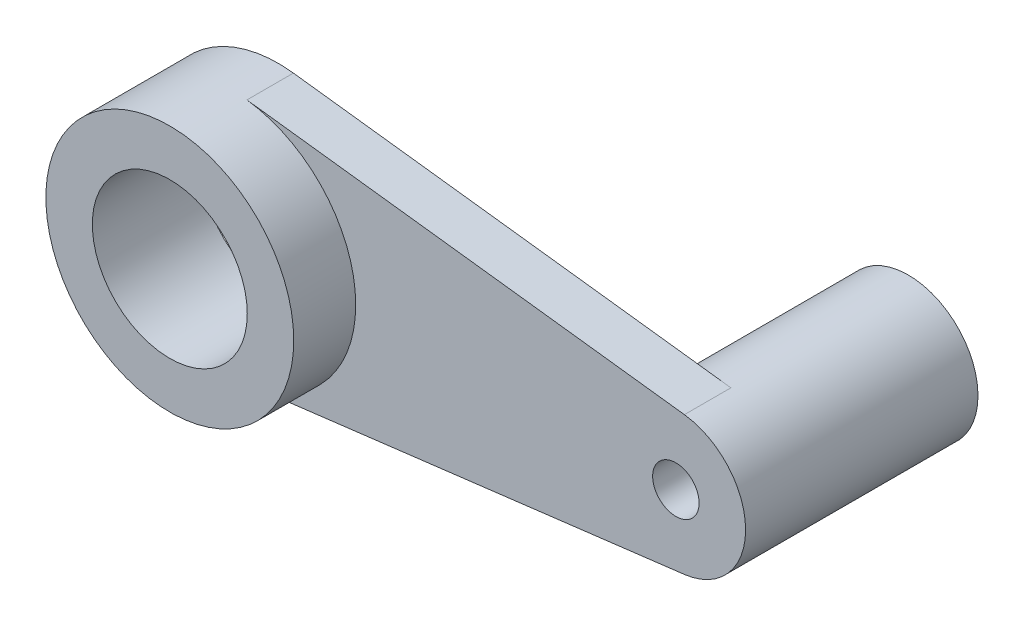
ISO-10303-21;
HEADER;
FILE_DESCRIPTION(('STEP AP214'),'2;1');
FILE_NAME('part.step','',(''),(''),'','','');
FILE_SCHEMA(('AUTOMOTIVE_DESIGN { 1 0 10303 214 1 1 1 1 }'));
ENDSEC;
DATA;
#1=APPLICATION_CONTEXT('core data for automotive mechanical design processes');
#2=APPLICATION_PROTOCOL_DEFINITION('international standard','automotive_design',2000,#1);
#3=PRODUCT_CONTEXT('',#1,'mechanical');
#4=PRODUCT('Part','Part','',(#3));
#5=PRODUCT_RELATED_PRODUCT_CATEGORY('part','',(#4));
#6=PRODUCT_DEFINITION_FORMATION('','',#4);
#7=PRODUCT_DEFINITION_CONTEXT('part definition',#1,'design');
#8=PRODUCT_DEFINITION('design','',#6,#7);
#9=PRODUCT_DEFINITION_SHAPE('','',#8);
#10=(LENGTH_UNIT() NAMED_UNIT(*) SI_UNIT(.MILLI.,.METRE.));
#11=(NAMED_UNIT(*) PLANE_ANGLE_UNIT() SI_UNIT($,.RADIAN.));
#12=(NAMED_UNIT(*) SI_UNIT($,.STERADIAN.) SOLID_ANGLE_UNIT());
#13=UNCERTAINTY_MEASURE_WITH_UNIT(LENGTH_MEASURE(1.E-05),#10,'distance_accuracy_value','');
#14=(GEOMETRIC_REPRESENTATION_CONTEXT(3) GLOBAL_UNCERTAINTY_ASSIGNED_CONTEXT((#13)) GLOBAL_UNIT_ASSIGNED_CONTEXT((#10,
#11,#12)) REPRESENTATION_CONTEXT('',''));
#15=CARTESIAN_POINT('',(0.,0.,0.));
#16=DIRECTION('',(0.,0.,1.));
#17=DIRECTION('',(1.,0.,0.));
#18=AXIS2_PLACEMENT_3D('',#15,#16,#17);
#19=CARTESIAN_POINT('',(0.,0.,14.));
#20=DIRECTION('',(0.,0.,-1.));
#21=DIRECTION('',(-1.,0.,0.));
#22=AXIS2_PLACEMENT_3D('',#19,#20,#21);
#23=CYLINDRICAL_SURFACE('',#22,16.);
#24=CARTESIAN_POINT('',(0.,0.,14.));
#25=DIRECTION('',(0.,0.,1.));
#26=DIRECTION('',(1.,0.,0.));
#27=AXIS2_PLACEMENT_3D('',#24,#25,#26);
#28=CIRCLE('',#27,16.);
#29=CARTESIAN_POINT('',(16.,0.,14.));
#30=VERTEX_POINT('',#29);
#31=EDGE_CURVE('E11',#30,#30,#28,.T.);
#32=ORIENTED_EDGE('',*,*,#31,.F.);
#33=EDGE_LOOP('',(#32));
#34=FACE_BOUND('',#33,.T.);
#35=DIRECTION('',(0.,0.,-1.));
#36=VECTOR('',#35,1.);
#37=CARTESIAN_POINT('',(1.95354893349608,-15.88029113601,6.));
#38=LINE('',#37,#36);
#39=CARTESIAN_POINT('',(1.95354893349608,-15.88029113601,6.));
#40=VERTEX_POINT('',#39);
#41=CARTESIAN_POINT('',(1.95354893349608,-15.88029113601,0.));
#42=VERTEX_POINT('',#41);
#43=EDGE_CURVE('E76',#40,#42,#38,.T.);
#44=ORIENTED_EDGE('',*,*,#43,.F.);
#45=CARTESIAN_POINT('',(0.,0.,6.));
#46=DIRECTION('',(0.,0.,1.));
#47=DIRECTION('',(1.,0.,0.));
#48=AXIS2_PLACEMENT_3D('',#45,#46,#47);
#49=CIRCLE('',#48,16.);
#50=CARTESIAN_POINT('',(1.95354893349608,15.88029113601,6.));
#51=VERTEX_POINT('',#50);
#52=EDGE_CURVE('E67',#40,#51,#49,.T.);
#53=ORIENTED_EDGE('',*,*,#52,.T.);
#54=DIRECTION('',(0.,0.,-1.));
#55=VECTOR('',#54,1.);
#56=CARTESIAN_POINT('',(1.95354893349608,15.88029113601,6.));
#57=LINE('',#56,#55);
#58=CARTESIAN_POINT('',(1.95354893349608,15.88029113601,0.));
#59=VERTEX_POINT('',#58);
#60=EDGE_CURVE('E59',#51,#59,#57,.T.);
#61=ORIENTED_EDGE('',*,*,#60,.T.);
#62=CARTESIAN_POINT('',(0.,0.,0.));
#63=DIRECTION('',(0.,0.,1.));
#64=DIRECTION('',(1.,0.,0.));
#65=AXIS2_PLACEMENT_3D('',#62,#63,#64);
#66=CIRCLE('',#65,16.);
#67=EDGE_CURVE('E44',#59,#42,#66,.T.);
#68=ORIENTED_EDGE('',*,*,#67,.T.);
#69=EDGE_LOOP('',(#44,#53,#61,#68));
#70=FACE_BOUND('',#69,.T.);
#71=ADVANCED_FACE('F41',(#34,#70),#23,.T.);
#72=CARTESIAN_POINT('',(0.,0.,14.));
#73=DIRECTION('',(0.,0.,-1.));
#74=DIRECTION('',(-1.,0.,0.));
#75=AXIS2_PLACEMENT_3D('',#72,#73,#74);
#76=CYLINDRICAL_SURFACE('',#75,10.);
#77=CARTESIAN_POINT('',(0.,0.,14.));
#78=DIRECTION('',(0.,0.,1.));
#79=DIRECTION('',(1.,0.,0.));
#80=AXIS2_PLACEMENT_3D('',#77,#78,#79);
#81=CIRCLE('',#80,10.);
#82=CARTESIAN_POINT('',(10.,0.,14.));
#83=VERTEX_POINT('',#82);
#84=EDGE_CURVE('E49',#83,#83,#81,.T.);
#85=ORIENTED_EDGE('',*,*,#84,.T.);
#86=EDGE_LOOP('',(#85));
#87=FACE_BOUND('',#86,.T.);
#88=CARTESIAN_POINT('',(0.,0.,0.));
#89=DIRECTION('',(0.,0.,1.));
#90=DIRECTION('',(1.,0.,0.));
#91=AXIS2_PLACEMENT_3D('',#88,#89,#90);
#92=CIRCLE('',#91,10.);
#93=CARTESIAN_POINT('',(10.,0.,0.));
#94=VERTEX_POINT('',#93);
#95=EDGE_CURVE('E99',#94,#94,#92,.T.);
#96=ORIENTED_EDGE('',*,*,#95,.F.);
#97=EDGE_LOOP('',(#96));
#98=FACE_BOUND('',#97,.T.);
#99=ADVANCED_FACE('F43',(#87,#98),#76,.F.);
#100=CARTESIAN_POINT('',(0.,0.,14.));
#101=DIRECTION('',(0.,0.,1.));
#102=DIRECTION('',(1.,0.,0.));
#103=AXIS2_PLACEMENT_3D('',#100,#101,#102);
#104=PLANE('',#103);
#105=ORIENTED_EDGE('',*,*,#84,.F.);
#106=EDGE_LOOP('',(#105));
#107=FACE_BOUND('',#106,.T.);
#108=ORIENTED_EDGE('',*,*,#31,.T.);
#109=EDGE_LOOP('',(#108));
#110=FACE_BOUND('',#109,.T.);
#111=ADVANCED_FACE('F155',(#107,#110),#104,.T.);
#112=CARTESIAN_POINT('',(0.,0.,0.));
#113=DIRECTION('',(0.,0.,1.));
#114=DIRECTION('',(1.,0.,0.));
#115=AXIS2_PLACEMENT_3D('',#112,#113,#114);
#116=PLANE('',#115);
#117=ORIENTED_EDGE('',*,*,#95,.T.);
#118=EDGE_LOOP('',(#117));
#119=FACE_BOUND('',#118,.T.);
#120=ORIENTED_EDGE('',*,*,#67,.F.);
#121=DIRECTION('',(-0.992518196000622,0.122096808343505,0.));
#122=VECTOR('',#121,1.);
#123=CARTESIAN_POINT('',(1.95354893349608,15.88029113601,0.));
#124=LINE('',#123,#122);
#125=CARTESIAN_POINT('',(58.4304272344114,8.93266376400559,0.));
#126=VERTEX_POINT('',#125);
#127=EDGE_CURVE('E98',#126,#59,#124,.T.);
#128=ORIENTED_EDGE('',*,*,#127,.F.);
#129=CARTESIAN_POINT('',(57.3315559593199,0.,0.));
#130=DIRECTION('',(0.,0.,1.));
#131=DIRECTION('',(1.,0.,0.));
#132=AXIS2_PLACEMENT_3D('',#129,#130,#131);
#133=CIRCLE('',#132,9.);
#134=CARTESIAN_POINT('',(58.4304272344114,-8.93266376400559,0.));
#135=VERTEX_POINT('',#134);
#136=EDGE_CURVE('E96',#126,#135,#133,.T.);
#137=ORIENTED_EDGE('',*,*,#136,.T.);
#138=DIRECTION('',(-0.992518196000622,-0.122096808343505,0.));
#139=VECTOR('',#138,1.);
#140=CARTESIAN_POINT('',(1.95354893349608,-15.88029113601,0.));
#141=LINE('',#140,#139);
#142=EDGE_CURVE('E81',#135,#42,#141,.T.);
#143=ORIENTED_EDGE('',*,*,#142,.T.);
#144=EDGE_LOOP('',(#120,#128,#137,#143));
#145=FACE_BOUND('',#144,.T.);
#146=ADVANCED_FACE('F91',(#119,#145),#116,.F.);
#147=CARTESIAN_POINT('',(1.95354893349608,15.88029113601,6.));
#148=DIRECTION('',(-0.122096808343505,-0.992518196000622,0.));
#149=DIRECTION('',(0.992518196000622,-0.122096808343505,0.));
#150=AXIS2_PLACEMENT_3D('',#147,#148,#149);
#151=PLANE('',#150);
#152=ORIENTED_EDGE('',*,*,#127,.T.);
#153=ORIENTED_EDGE('',*,*,#60,.F.);
#154=DIRECTION('',(-0.992518196000622,0.122096808343505,0.));
#155=VECTOR('',#154,1.);
#156=CARTESIAN_POINT('',(1.95354893349608,15.88029113601,6.));
#157=LINE('',#156,#155);
#158=CARTESIAN_POINT('',(58.4304272344114,8.93266376400559,6.));
#159=VERTEX_POINT('',#158);
#160=EDGE_CURVE('E100',#159,#51,#157,.T.);
#161=ORIENTED_EDGE('',*,*,#160,.F.);
#162=DIRECTION('',(0.,0.,-1.));
#163=VECTOR('',#162,1.);
#164=CARTESIAN_POINT('',(58.4304272344114,8.93266376400559,6.));
#165=LINE('',#164,#163);
#166=EDGE_CURVE('E102',#159,#126,#165,.T.);
#167=ORIENTED_EDGE('',*,*,#166,.T.);
#168=EDGE_LOOP('',(#152,#153,#161,#167));
#169=FACE_BOUND('',#168,.T.);
#170=ADVANCED_FACE('F142',(#169),#151,.F.);
#171=CARTESIAN_POINT('',(1.95354893349608,-15.88029113601,6.));
#172=DIRECTION('',(0.122096808343505,-0.992518196000622,0.));
#173=DIRECTION('',(0.992518196000622,0.122096808343505,0.));
#174=AXIS2_PLACEMENT_3D('',#171,#172,#173);
#175=PLANE('',#174);
#176=ORIENTED_EDGE('',*,*,#142,.F.);
#177=DIRECTION('',(0.,0.,-1.));
#178=VECTOR('',#177,1.);
#179=CARTESIAN_POINT('',(58.4304272344114,-8.93266376400559,6.));
#180=LINE('',#179,#178);
#181=CARTESIAN_POINT('',(58.4304272344114,-8.9326637640056,6.));
#182=VERTEX_POINT('',#181);
#183=EDGE_CURVE('E86',#182,#135,#180,.T.);
#184=ORIENTED_EDGE('',*,*,#183,.F.);
#185=DIRECTION('',(-0.992518196000622,-0.122096808343505,0.));
#186=VECTOR('',#185,1.);
#187=CARTESIAN_POINT('',(1.95354893349608,-15.88029113601,6.));
#188=LINE('',#187,#186);
#189=EDGE_CURVE('E83',#182,#40,#188,.T.);
#190=ORIENTED_EDGE('',*,*,#189,.T.);
#191=ORIENTED_EDGE('',*,*,#43,.T.);
#192=EDGE_LOOP('',(#176,#184,#190,#191));
#193=FACE_BOUND('',#192,.T.);
#194=ADVANCED_FACE('F84',(#193),#175,.T.);
#195=CARTESIAN_POINT('',(0.,0.,6.));
#196=DIRECTION('',(0.,0.,1.));
#197=DIRECTION('',(1.,0.,0.));
#198=AXIS2_PLACEMENT_3D('',#195,#196,#197);
#199=PLANE('',#198);
#200=ORIENTED_EDGE('',*,*,#189,.F.);
#201=CARTESIAN_POINT('',(57.3315559593199,0.,6.));
#202=DIRECTION('',(0.,0.,1.));
#203=DIRECTION('',(1.,0.,0.));
#204=AXIS2_PLACEMENT_3D('',#201,#202,#203);
#205=CIRCLE('',#204,9.);
#206=EDGE_CURVE('E125',#182,#159,#205,.T.);
#207=ORIENTED_EDGE('',*,*,#206,.T.);
#208=ORIENTED_EDGE('',*,*,#160,.T.);
#209=ORIENTED_EDGE('',*,*,#52,.F.);
#210=EDGE_LOOP('',(#200,#207,#208,#209));
#211=FACE_BOUND('',#210,.T.);
#212=CARTESIAN_POINT('',(57.3315559593199,0.,6.));
#213=DIRECTION('',(0.,0.,1.));
#214=DIRECTION('',(1.,0.,0.));
#215=AXIS2_PLACEMENT_3D('',#212,#213,#214);
#216=CIRCLE('',#215,3.);
#217=CARTESIAN_POINT('',(60.3315559593199,0.,6.));
#218=VERTEX_POINT('',#217);
#219=EDGE_CURVE('E127',#218,#218,#216,.T.);
#220=ORIENTED_EDGE('',*,*,#219,.F.);
#221=EDGE_LOOP('',(#220));
#222=FACE_BOUND('',#221,.T.);
#223=ADVANCED_FACE('F134',(#211,#222),#199,.T.);
#224=CARTESIAN_POINT('',(57.3315559593199,0.,-24.));
#225=DIRECTION('',(0.,0.,1.));
#226=DIRECTION('',(1.,0.,0.));
#227=AXIS2_PLACEMENT_3D('',#224,#225,#226);
#228=CYLINDRICAL_SURFACE('',#227,9.);
#229=CARTESIAN_POINT('',(57.3315559593199,0.,-24.));
#230=DIRECTION('',(0.,0.,1.));
#231=DIRECTION('',(1.,0.,0.));
#232=AXIS2_PLACEMENT_3D('',#229,#230,#231);
#233=CIRCLE('',#232,9.);
#234=CARTESIAN_POINT('',(66.3315559593199,0.,-24.));
#235=VERTEX_POINT('',#234);
#236=EDGE_CURVE('E111',#235,#235,#233,.T.);
#237=ORIENTED_EDGE('',*,*,#236,.T.);
#238=EDGE_LOOP('',(#237));
#239=FACE_BOUND('',#238,.T.);
#240=ORIENTED_EDGE('',*,*,#166,.F.);
#241=ORIENTED_EDGE('',*,*,#206,.F.);
#242=ORIENTED_EDGE('',*,*,#183,.T.);
#243=ORIENTED_EDGE('',*,*,#136,.F.);
#244=EDGE_LOOP('',(#240,#241,#242,#243));
#245=FACE_BOUND('',#244,.T.);
#246=ADVANCED_FACE('F135',(#239,#245),#228,.T.);
#247=CARTESIAN_POINT('',(57.3315559593199,0.,-24.));
#248=DIRECTION('',(0.,0.,1.));
#249=DIRECTION('',(1.,0.,0.));
#250=AXIS2_PLACEMENT_3D('',#247,#248,#249);
#251=CYLINDRICAL_SURFACE('',#250,3.);
#252=CARTESIAN_POINT('',(57.3315559593199,0.,-24.));
#253=DIRECTION('',(0.,0.,1.));
#254=DIRECTION('',(1.,0.,0.));
#255=AXIS2_PLACEMENT_3D('',#252,#253,#254);
#256=CIRCLE('',#255,3.);
#257=CARTESIAN_POINT('',(60.3315559593199,0.,-24.));
#258=VERTEX_POINT('',#257);
#259=EDGE_CURVE('E116',#258,#258,#256,.T.);
#260=ORIENTED_EDGE('',*,*,#259,.F.);
#261=EDGE_LOOP('',(#260));
#262=FACE_BOUND('',#261,.T.);
#263=ORIENTED_EDGE('',*,*,#219,.T.);
#264=EDGE_LOOP('',(#263));
#265=FACE_BOUND('',#264,.T.);
#266=ADVANCED_FACE('F128',(#262,#265),#251,.F.);
#267=CARTESIAN_POINT('',(0.,0.,-24.));
#268=DIRECTION('',(0.,0.,1.));
#269=DIRECTION('',(1.,0.,0.));
#270=AXIS2_PLACEMENT_3D('',#267,#268,#269);
#271=PLANE('',#270);
#272=ORIENTED_EDGE('',*,*,#259,.T.);
#273=EDGE_LOOP('',(#272));
#274=FACE_BOUND('',#273,.T.);
#275=ORIENTED_EDGE('',*,*,#236,.F.);
#276=EDGE_LOOP('',(#275));
#277=FACE_BOUND('',#276,.T.);
#278=ADVANCED_FACE('F196',(#274,#277),#271,.F.);
#279=CLOSED_SHELL('',(#71,#99,#111,#146,#170,#194,#223,#246,#266,#278));
#280=MANIFOLD_SOLID_BREP('B2',#279);
#281=ADVANCED_BREP_SHAPE_REPRESENTATION('',(#18,#280),#14);
#282=SHAPE_DEFINITION_REPRESENTATION(#9,#281);
ENDSEC;
END-ISO-10303-21;
